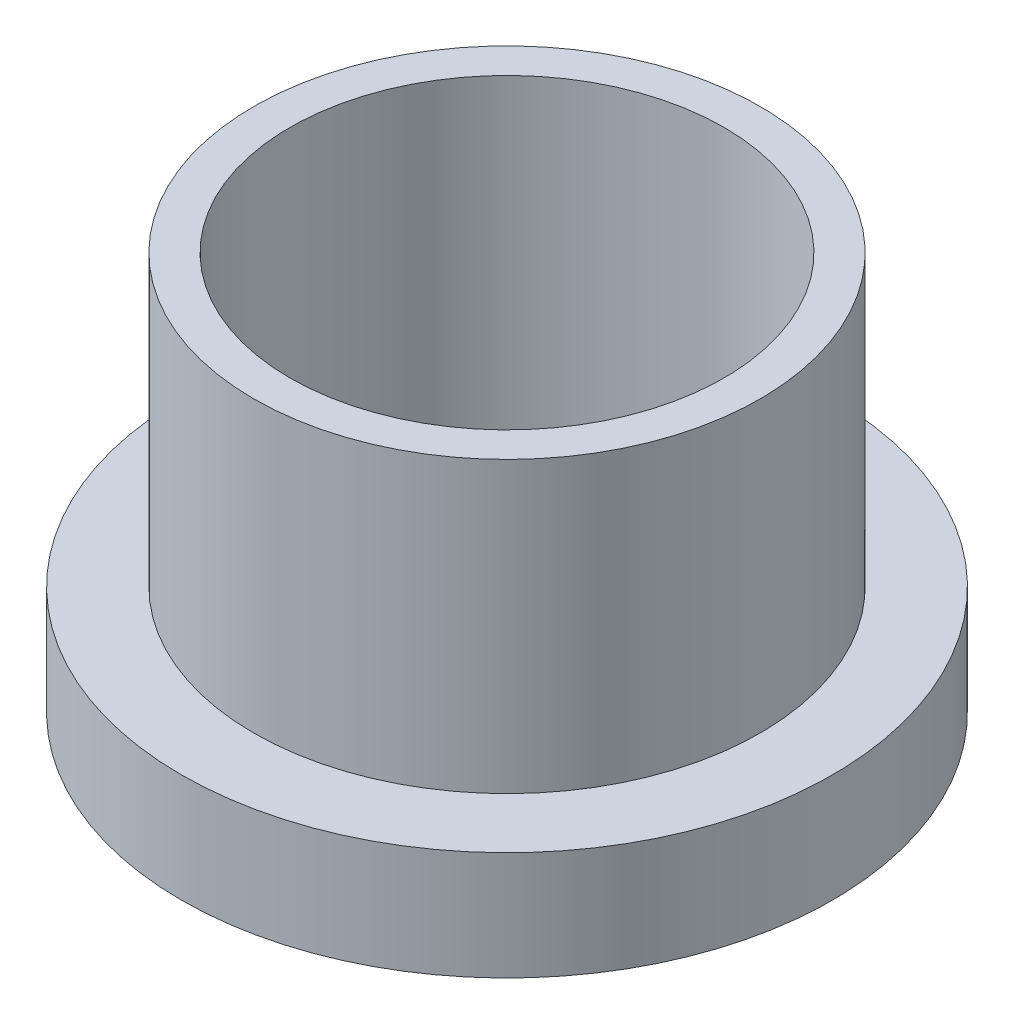
ISO-10303-21;
HEADER;
FILE_DESCRIPTION(('STEP AP214'),'2;1');
FILE_NAME('part.step','',(''),(''),'','','');
FILE_SCHEMA(('AUTOMOTIVE_DESIGN { 1 0 10303 214 1 1 1 1 }'));
ENDSEC;
DATA;
#1=APPLICATION_CONTEXT('core data for automotive mechanical design processes');
#2=APPLICATION_PROTOCOL_DEFINITION('international standard','automotive_design',2000,#1);
#3=PRODUCT_CONTEXT('',#1,'mechanical');
#4=PRODUCT('Part','Part','',(#3));
#5=PRODUCT_RELATED_PRODUCT_CATEGORY('part','',(#4));
#6=PRODUCT_DEFINITION_FORMATION('','',#4);
#7=PRODUCT_DEFINITION_CONTEXT('part definition',#1,'design');
#8=PRODUCT_DEFINITION('design','',#6,#7);
#9=PRODUCT_DEFINITION_SHAPE('','',#8);
#10=(LENGTH_UNIT() NAMED_UNIT(*) SI_UNIT(.MILLI.,.METRE.));
#11=(NAMED_UNIT(*) PLANE_ANGLE_UNIT() SI_UNIT($,.RADIAN.));
#12=(NAMED_UNIT(*) SI_UNIT($,.STERADIAN.) SOLID_ANGLE_UNIT());
#13=UNCERTAINTY_MEASURE_WITH_UNIT(LENGTH_MEASURE(1.E-05),#10,'distance_accuracy_value','');
#14=(GEOMETRIC_REPRESENTATION_CONTEXT(3) GLOBAL_UNCERTAINTY_ASSIGNED_CONTEXT((#13)) GLOBAL_UNIT_ASSIGNED_CONTEXT((#10,
#11,#12)) REPRESENTATION_CONTEXT('',''));
#15=CARTESIAN_POINT('',(0.,0.,0.));
#16=DIRECTION('',(0.,0.,1.));
#17=DIRECTION('',(1.,0.,0.));
#18=AXIS2_PLACEMENT_3D('',#15,#16,#17);
#19=CARTESIAN_POINT('',(0.,3.,0.));
#20=DIRECTION('',(0.,-1.,0.));
#21=DIRECTION('',(0.,0.,-1.));
#22=AXIS2_PLACEMENT_3D('',#19,#20,#21);
#23=CYLINDRICAL_SURFACE('',#22,9.);
#24=CARTESIAN_POINT('',(0.,3.,0.));
#25=DIRECTION('',(0.,1.,0.));
#26=DIRECTION('',(0.,0.,1.));
#27=AXIS2_PLACEMENT_3D('',#24,#25,#26);
#28=CIRCLE('',#27,9.);
#29=CARTESIAN_POINT('',(0.,3.,9.));
#30=VERTEX_POINT('',#29);
#31=EDGE_CURVE('E38',#30,#30,#28,.T.);
#32=ORIENTED_EDGE('',*,*,#31,.F.);
#33=EDGE_LOOP('',(#32));
#34=FACE_BOUND('',#33,.T.);
#35=CARTESIAN_POINT('',(0.,0.,0.));
#36=DIRECTION('',(0.,1.,0.));
#37=DIRECTION('',(0.,0.,1.));
#38=AXIS2_PLACEMENT_3D('',#35,#36,#37);
#39=CIRCLE('',#38,9.);
#40=CARTESIAN_POINT('',(0.,0.,9.));
#41=VERTEX_POINT('',#40);
#42=EDGE_CURVE('E34',#41,#41,#39,.T.);
#43=ORIENTED_EDGE('',*,*,#42,.T.);
#44=EDGE_LOOP('',(#43));
#45=FACE_BOUND('',#44,.T.);
#46=ADVANCED_FACE('F31',(#34,#45),#23,.T.);
#47=CARTESIAN_POINT('',(0.,3.,0.));
#48=DIRECTION('',(0.,1.,0.));
#49=DIRECTION('',(0.,0.,1.));
#50=AXIS2_PLACEMENT_3D('',#47,#48,#49);
#51=PLANE('',#50);
#52=CARTESIAN_POINT('',(0.,3.,0.));
#53=DIRECTION('',(0.,1.,0.));
#54=DIRECTION('',(0.,0.,1.));
#55=AXIS2_PLACEMENT_3D('',#52,#53,#54);
#56=CIRCLE('',#55,7.);
#57=CARTESIAN_POINT('',(0.,3.,7.));
#58=VERTEX_POINT('',#57);
#59=EDGE_CURVE('E10',#58,#58,#56,.T.);
#60=ORIENTED_EDGE('',*,*,#59,.F.);
#61=EDGE_LOOP('',(#60));
#62=FACE_BOUND('',#61,.T.);
#63=ORIENTED_EDGE('',*,*,#31,.T.);
#64=EDGE_LOOP('',(#63));
#65=FACE_BOUND('',#64,.T.);
#66=ADVANCED_FACE('F75',(#62,#65),#51,.T.);
#67=CARTESIAN_POINT('',(0.,0.,0.));
#68=DIRECTION('',(0.,1.,0.));
#69=DIRECTION('',(0.,0.,1.));
#70=AXIS2_PLACEMENT_3D('',#67,#68,#69);
#71=PLANE('',#70);
#72=CARTESIAN_POINT('',(0.,0.,0.));
#73=DIRECTION('',(0.,1.,0.));
#74=DIRECTION('',(0.,0.,1.));
#75=AXIS2_PLACEMENT_3D('',#72,#73,#74);
#76=CIRCLE('',#75,6.);
#77=CARTESIAN_POINT('',(0.,0.,6.));
#78=VERTEX_POINT('',#77);
#79=EDGE_CURVE('E47',#78,#78,#76,.T.);
#80=ORIENTED_EDGE('',*,*,#79,.T.);
#81=EDGE_LOOP('',(#80));
#82=FACE_BOUND('',#81,.T.);
#83=ORIENTED_EDGE('',*,*,#42,.F.);
#84=EDGE_LOOP('',(#83));
#85=FACE_BOUND('',#84,.T.);
#86=ADVANCED_FACE('F54',(#82,#85),#71,.F.);
#87=CARTESIAN_POINT('',(0.,11.,0.));
#88=DIRECTION('',(0.,-1.,0.));
#89=DIRECTION('',(0.,0.,-1.));
#90=AXIS2_PLACEMENT_3D('',#87,#88,#89);
#91=CYLINDRICAL_SURFACE('',#90,7.);
#92=CARTESIAN_POINT('',(0.,11.,0.));
#93=DIRECTION('',(0.,1.,0.));
#94=DIRECTION('',(0.,0.,1.));
#95=AXIS2_PLACEMENT_3D('',#92,#93,#94);
#96=CIRCLE('',#95,7.);
#97=CARTESIAN_POINT('',(0.,11.,7.));
#98=VERTEX_POINT('',#97);
#99=EDGE_CURVE('E44',#98,#98,#96,.T.);
#100=ORIENTED_EDGE('',*,*,#99,.F.);
#101=EDGE_LOOP('',(#100));
#102=FACE_BOUND('',#101,.T.);
#103=ORIENTED_EDGE('',*,*,#59,.T.);
#104=EDGE_LOOP('',(#103));
#105=FACE_BOUND('',#104,.T.);
#106=ADVANCED_FACE('F66',(#102,#105),#91,.T.);
#107=CARTESIAN_POINT('',(0.,11.,0.));
#108=DIRECTION('',(0.,1.,0.));
#109=DIRECTION('',(0.,0.,1.));
#110=AXIS2_PLACEMENT_3D('',#107,#108,#109);
#111=PLANE('',#110);
#112=CARTESIAN_POINT('',(0.,11.,0.));
#113=DIRECTION('',(0.,1.,0.));
#114=DIRECTION('',(0.,0.,1.));
#115=AXIS2_PLACEMENT_3D('',#112,#113,#114);
#116=CIRCLE('',#115,6.);
#117=CARTESIAN_POINT('',(0.,11.,6.));
#118=VERTEX_POINT('',#117);
#119=EDGE_CURVE('E48',#118,#118,#116,.T.);
#120=ORIENTED_EDGE('',*,*,#119,.F.);
#121=EDGE_LOOP('',(#120));
#122=FACE_BOUND('',#121,.T.);
#123=ORIENTED_EDGE('',*,*,#99,.T.);
#124=EDGE_LOOP('',(#123));
#125=FACE_BOUND('',#124,.T.);
#126=ADVANCED_FACE('F60',(#122,#125),#111,.T.);
#127=CARTESIAN_POINT('',(0.,0.,0.));
#128=DIRECTION('',(0.,1.,0.));
#129=DIRECTION('',(0.,0.,1.));
#130=AXIS2_PLACEMENT_3D('',#127,#128,#129);
#131=CYLINDRICAL_SURFACE('',#130,6.);
#132=ORIENTED_EDGE('',*,*,#79,.F.);
#133=EDGE_LOOP('',(#132));
#134=FACE_BOUND('',#133,.T.);
#135=ORIENTED_EDGE('',*,*,#119,.T.);
#136=EDGE_LOOP('',(#135));
#137=FACE_BOUND('',#136,.T.);
#138=ADVANCED_FACE('F57',(#134,#137),#131,.F.);
#139=CLOSED_SHELL('',(#46,#66,#86,#106,#126,#138));
#140=MANIFOLD_SOLID_BREP('B2',#139);
#141=ADVANCED_BREP_SHAPE_REPRESENTATION('',(#18,#140),#14);
#142=SHAPE_DEFINITION_REPRESENTATION(#9,#141);
ENDSEC;
END-ISO-10303-21;
